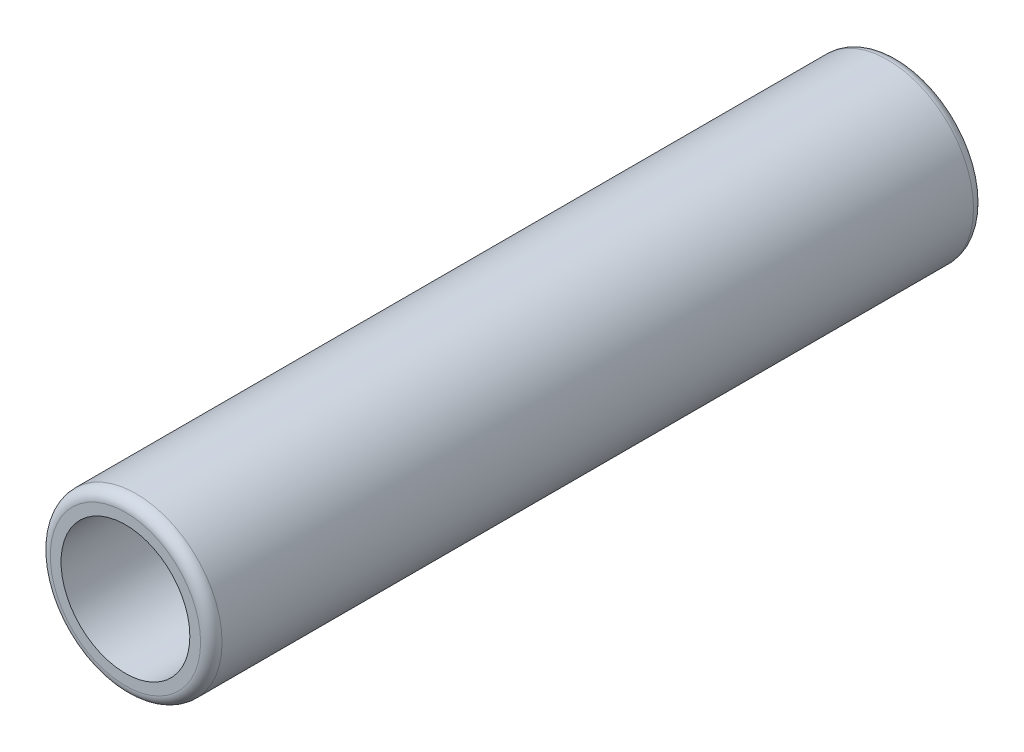
ISO-10303-21;
HEADER;
FILE_DESCRIPTION(('STEP AP214'),'2;1');
FILE_NAME('part.step','',(''),(''),'','','');
FILE_SCHEMA(('AUTOMOTIVE_DESIGN { 1 0 10303 214 1 1 1 1 }'));
ENDSEC;
DATA;
#1=APPLICATION_CONTEXT('core data for automotive mechanical design processes');
#2=APPLICATION_PROTOCOL_DEFINITION('international standard','automotive_design',2000,#1);
#3=PRODUCT_CONTEXT('',#1,'mechanical');
#4=PRODUCT('Part','Part','',(#3));
#5=PRODUCT_RELATED_PRODUCT_CATEGORY('part','',(#4));
#6=PRODUCT_DEFINITION_FORMATION('','',#4);
#7=PRODUCT_DEFINITION_CONTEXT('part definition',#1,'design');
#8=PRODUCT_DEFINITION('design','',#6,#7);
#9=PRODUCT_DEFINITION_SHAPE('','',#8);
#10=(LENGTH_UNIT() NAMED_UNIT(*) SI_UNIT(.MILLI.,.METRE.));
#11=(NAMED_UNIT(*) PLANE_ANGLE_UNIT() SI_UNIT($,.RADIAN.));
#12=(NAMED_UNIT(*) SI_UNIT($,.STERADIAN.) SOLID_ANGLE_UNIT());
#13=UNCERTAINTY_MEASURE_WITH_UNIT(LENGTH_MEASURE(1.E-05),#10,'distance_accuracy_value','');
#14=(GEOMETRIC_REPRESENTATION_CONTEXT(3) GLOBAL_UNCERTAINTY_ASSIGNED_CONTEXT((#13)) GLOBAL_UNIT_ASSIGNED_CONTEXT((#10,
#11,#12)) REPRESENTATION_CONTEXT('',''));
#15=CARTESIAN_POINT('',(0.,0.,0.));
#16=DIRECTION('',(0.,0.,1.));
#17=DIRECTION('',(1.,0.,0.));
#18=AXIS2_PLACEMENT_3D('',#15,#16,#17);
#19=CARTESIAN_POINT('',(0.,0.,36.));
#20=DIRECTION('',(0.,0.,1.));
#21=DIRECTION('',(1.,0.,0.));
#22=AXIS2_PLACEMENT_3D('',#19,#20,#21);
#23=PLANE('',#22);
#24=CARTESIAN_POINT('',(0.,0.,36.));
#25=DIRECTION('',(0.,0.,1.));
#26=DIRECTION('',(1.,0.,0.));
#27=AXIS2_PLACEMENT_3D('',#24,#25,#26);
#28=CIRCLE('',#27,3.5);
#29=CARTESIAN_POINT('',(3.5,0.,36.));
#30=VERTEX_POINT('',#29);
#31=EDGE_CURVE('E10',#30,#30,#28,.T.);
#32=ORIENTED_EDGE('',*,*,#31,.T.);
#33=EDGE_LOOP('',(#32));
#34=FACE_BOUND('',#33,.T.);
#35=CARTESIAN_POINT('',(0.,0.,36.));
#36=DIRECTION('',(0.,0.,1.));
#37=DIRECTION('',(1.,0.,0.));
#38=AXIS2_PLACEMENT_3D('',#35,#36,#37);
#39=CIRCLE('',#38,3.);
#40=CARTESIAN_POINT('',(3.,0.,36.));
#41=VERTEX_POINT('',#40);
#42=EDGE_CURVE('E54',#41,#41,#39,.T.);
#43=ORIENTED_EDGE('',*,*,#42,.F.);
#44=EDGE_LOOP('',(#43));
#45=FACE_BOUND('',#44,.T.);
#46=ADVANCED_FACE('F34',(#34,#45),#23,.T.);
#47=CARTESIAN_POINT('',(0.,0.,0.));
#48=DIRECTION('',(0.,0.,1.));
#49=DIRECTION('',(1.,0.,0.));
#50=AXIS2_PLACEMENT_3D('',#47,#48,#49);
#51=PLANE('',#50);
#52=CARTESIAN_POINT('',(0.,0.,0.));
#53=DIRECTION('',(0.,0.,1.));
#54=DIRECTION('',(1.,0.,0.));
#55=AXIS2_PLACEMENT_3D('',#52,#53,#54);
#56=CIRCLE('',#55,3.5);
#57=CARTESIAN_POINT('',(3.5,0.,0.));
#58=VERTEX_POINT('',#57);
#59=EDGE_CURVE('E41',#58,#58,#56,.F.);
#60=ORIENTED_EDGE('',*,*,#59,.T.);
#61=EDGE_LOOP('',(#60));
#62=FACE_BOUND('',#61,.T.);
#63=CARTESIAN_POINT('',(0.,0.,0.));
#64=DIRECTION('',(0.,0.,1.));
#65=DIRECTION('',(1.,0.,0.));
#66=AXIS2_PLACEMENT_3D('',#63,#64,#65);
#67=CIRCLE('',#66,3.);
#68=CARTESIAN_POINT('',(3.,0.,0.));
#69=VERTEX_POINT('',#68);
#70=EDGE_CURVE('E55',#69,#69,#67,.T.);
#71=ORIENTED_EDGE('',*,*,#70,.T.);
#72=EDGE_LOOP('',(#71));
#73=FACE_BOUND('',#72,.T.);
#74=ADVANCED_FACE('F65',(#62,#73),#51,.F.);
#75=CARTESIAN_POINT('',(0.,0.,36.));
#76=DIRECTION('',(0.,0.,-1.));
#77=DIRECTION('',(-1.,0.,0.));
#78=AXIS2_PLACEMENT_3D('',#75,#76,#77);
#79=CYLINDRICAL_SURFACE('',#78,4.);
#80=CARTESIAN_POINT('',(0.,0.,0.5));
#81=DIRECTION('',(0.,0.,1.));
#82=DIRECTION('',(1.,0.,0.));
#83=AXIS2_PLACEMENT_3D('',#80,#81,#82);
#84=CIRCLE('',#83,4.);
#85=CARTESIAN_POINT('',(4.,0.,0.5));
#86=VERTEX_POINT('',#85);
#87=EDGE_CURVE('E45',#86,#86,#84,.T.);
#88=ORIENTED_EDGE('',*,*,#87,.T.);
#89=EDGE_LOOP('',(#88));
#90=FACE_BOUND('',#89,.T.);
#91=CARTESIAN_POINT('',(0.,0.,35.5));
#92=DIRECTION('',(0.,0.,1.));
#93=DIRECTION('',(1.,0.,0.));
#94=AXIS2_PLACEMENT_3D('',#91,#92,#93);
#95=CIRCLE('',#94,4.);
#96=CARTESIAN_POINT('',(4.,0.,35.5));
#97=VERTEX_POINT('',#96);
#98=EDGE_CURVE('E49',#97,#97,#95,.F.);
#99=ORIENTED_EDGE('',*,*,#98,.T.);
#100=EDGE_LOOP('',(#99));
#101=FACE_BOUND('',#100,.T.);
#102=ADVANCED_FACE('F70',(#90,#101),#79,.T.);
#103=CARTESIAN_POINT('',(0.,0.,36.));
#104=DIRECTION('',(0.,0.,-1.));
#105=DIRECTION('',(-1.,0.,0.));
#106=AXIS2_PLACEMENT_3D('',#103,#104,#105);
#107=CYLINDRICAL_SURFACE('',#106,3.);
#108=ORIENTED_EDGE('',*,*,#42,.T.);
#109=EDGE_LOOP('',(#108));
#110=FACE_BOUND('',#109,.T.);
#111=ORIENTED_EDGE('',*,*,#70,.F.);
#112=EDGE_LOOP('',(#111));
#113=FACE_BOUND('',#112,.T.);
#114=ADVANCED_FACE('F61',(#110,#113),#107,.F.);
#115=CARTESIAN_POINT('',(0.,0.,0.5));
#116=DIRECTION('',(0.,0.,1.));
#117=DIRECTION('',(1.,0.,0.));
#118=AXIS2_PLACEMENT_3D('',#115,#116,#117);
#119=TOROIDAL_SURFACE('',#118,3.5,0.5);
#120=ORIENTED_EDGE('',*,*,#59,.F.);
#121=EDGE_LOOP('',(#120));
#122=FACE_BOUND('',#121,.T.);
#123=ORIENTED_EDGE('',*,*,#87,.F.);
#124=EDGE_LOOP('',(#123));
#125=FACE_BOUND('',#124,.T.);
#126=ADVANCED_FACE('F76',(#122,#125),#119,.T.);
#127=CARTESIAN_POINT('',(0.,0.,35.5));
#128=DIRECTION('',(0.,0.,1.));
#129=DIRECTION('',(1.,0.,0.));
#130=AXIS2_PLACEMENT_3D('',#127,#128,#129);
#131=TOROIDAL_SURFACE('',#130,3.5,0.5);
#132=ORIENTED_EDGE('',*,*,#98,.F.);
#133=EDGE_LOOP('',(#132));
#134=FACE_BOUND('',#133,.T.);
#135=ORIENTED_EDGE('',*,*,#31,.F.);
#136=EDGE_LOOP('',(#135));
#137=FACE_BOUND('',#136,.T.);
#138=ADVANCED_FACE('F36',(#134,#137),#131,.T.);
#139=CLOSED_SHELL('',(#46,#74,#102,#114,#126,#138));
#140=MANIFOLD_SOLID_BREP('B2',#139);
#141=ADVANCED_BREP_SHAPE_REPRESENTATION('',(#18,#140),#14);
#142=SHAPE_DEFINITION_REPRESENTATION(#9,#141);
ENDSEC;
END-ISO-10303-21;
